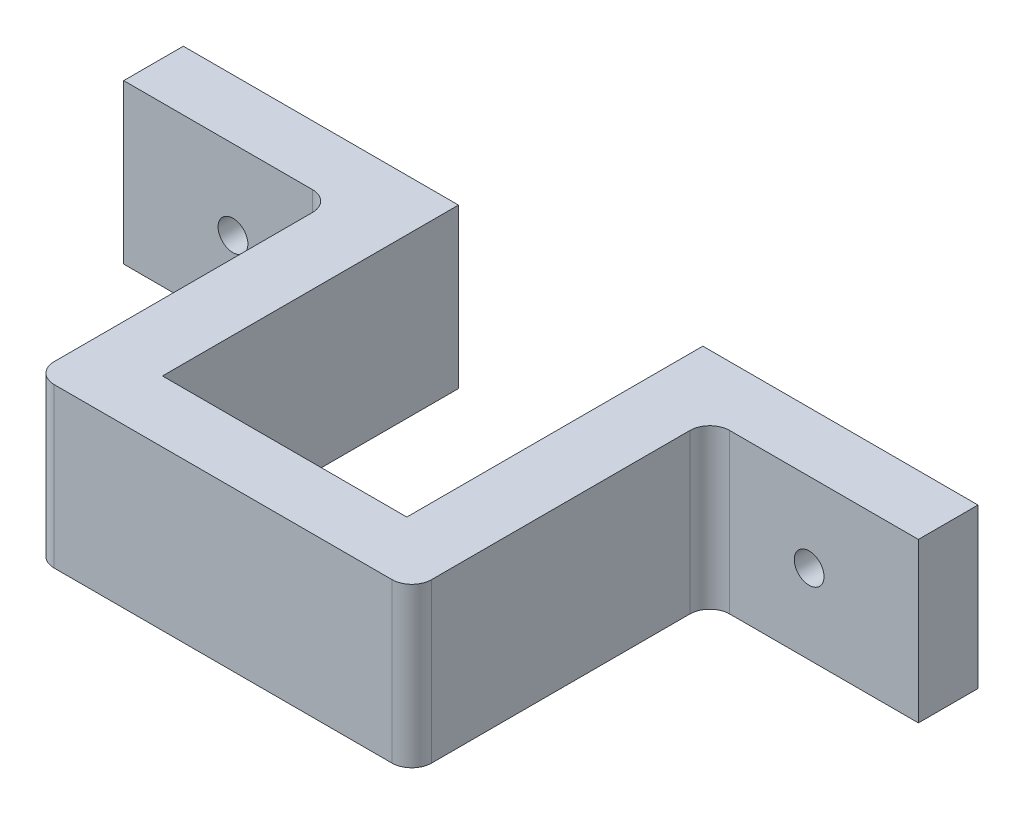
ISO-10303-21;
HEADER;
FILE_DESCRIPTION(('STEP AP214'),'2;1');
FILE_NAME('part.step','',(''),(''),'','','');
FILE_SCHEMA(('AUTOMOTIVE_DESIGN { 1 0 10303 214 1 1 1 1 }'));
ENDSEC;
DATA;
#1=APPLICATION_CONTEXT('core data for automotive mechanical design processes');
#2=APPLICATION_PROTOCOL_DEFINITION('international standard','automotive_design',2000,#1);
#3=PRODUCT_CONTEXT('',#1,'mechanical');
#4=PRODUCT('Part','Part','',(#3));
#5=PRODUCT_RELATED_PRODUCT_CATEGORY('part','',(#4));
#6=PRODUCT_DEFINITION_FORMATION('','',#4);
#7=PRODUCT_DEFINITION_CONTEXT('part definition',#1,'design');
#8=PRODUCT_DEFINITION('design','',#6,#7);
#9=PRODUCT_DEFINITION_SHAPE('','',#8);
#10=(LENGTH_UNIT() NAMED_UNIT(*) SI_UNIT(.MILLI.,.METRE.));
#11=(NAMED_UNIT(*) PLANE_ANGLE_UNIT() SI_UNIT($,.RADIAN.));
#12=(NAMED_UNIT(*) SI_UNIT($,.STERADIAN.) SOLID_ANGLE_UNIT());
#13=UNCERTAINTY_MEASURE_WITH_UNIT(LENGTH_MEASURE(1.E-05),#10,'distance_accuracy_value','');
#14=(GEOMETRIC_REPRESENTATION_CONTEXT(3) GLOBAL_UNCERTAINTY_ASSIGNED_CONTEXT((#13)) GLOBAL_UNIT_ASSIGNED_CONTEXT((#10,
#11,#12)) REPRESENTATION_CONTEXT('',''));
#15=CARTESIAN_POINT('',(0.,0.,0.));
#16=DIRECTION('',(0.,0.,1.));
#17=DIRECTION('',(1.,0.,0.));
#18=AXIS2_PLACEMENT_3D('',#15,#16,#17);
#19=CARTESIAN_POINT('',(0.,0.,0.));
#20=DIRECTION('',(0.,0.,1.));
#21=DIRECTION('',(1.,0.,0.));
#22=AXIS2_PLACEMENT_3D('',#19,#20,#21);
#23=PLANE('',#22);
#24=CARTESIAN_POINT('',(-14.5,0.,0.));
#25=DIRECTION('',(0.,0.,1.));
#26=DIRECTION('',(1.,0.,0.));
#27=AXIS2_PLACEMENT_3D('',#24,#25,#26);
#28=CIRCLE('',#27,0.75);
#29=CARTESIAN_POINT('',(-13.75,0.,0.));
#30=VERTEX_POINT('',#29);
#31=EDGE_CURVE('E196',#30,#30,#28,.T.);
#32=ORIENTED_EDGE('',*,*,#31,.T.);
#33=EDGE_LOOP('',(#32));
#34=FACE_BOUND('',#33,.T.);
#35=DIRECTION('',(-1.,0.,0.));
#36=VECTOR('',#35,1.);
#37=CARTESIAN_POINT('',(0.,4.,0.));
#38=LINE('',#37,#36);
#39=CARTESIAN_POINT('',(-6.15,4.,0.));
#40=VERTEX_POINT('',#39);
#41=CARTESIAN_POINT('',(-20.,4.,0.));
#42=VERTEX_POINT('',#41);
#43=EDGE_CURVE('E232',#40,#42,#38,.T.);
#44=ORIENTED_EDGE('',*,*,#43,.F.);
#45=DIRECTION('',(0.,-1.,0.));
#46=VECTOR('',#45,1.);
#47=CARTESIAN_POINT('',(-6.15,0.,0.));
#48=LINE('',#47,#46);
#49=CARTESIAN_POINT('',(-6.15,-4.,0.));
#50=VERTEX_POINT('',#49);
#51=EDGE_CURVE('E246',#40,#50,#48,.T.);
#52=ORIENTED_EDGE('',*,*,#51,.T.);
#53=DIRECTION('',(-1.,0.,0.));
#54=VECTOR('',#53,1.);
#55=CARTESIAN_POINT('',(0.,-4.,0.));
#56=LINE('',#55,#54);
#57=CARTESIAN_POINT('',(-20.,-4.,0.));
#58=VERTEX_POINT('',#57);
#59=EDGE_CURVE('E226',#50,#58,#56,.T.);
#60=ORIENTED_EDGE('',*,*,#59,.T.);
#61=DIRECTION('',(0.,1.,0.));
#62=VECTOR('',#61,1.);
#63=CARTESIAN_POINT('',(-20.,0.,0.));
#64=LINE('',#63,#62);
#65=EDGE_CURVE('E223',#58,#42,#64,.T.);
#66=ORIENTED_EDGE('',*,*,#65,.T.);
#67=EDGE_LOOP('',(#44,#52,#60,#66));
#68=FACE_BOUND('',#67,.T.);
#69=ADVANCED_FACE('F35',(#34,#68),#23,.F.);
#70=CARTESIAN_POINT('',(0.,0.,3.));
#71=DIRECTION('',(0.,0.,1.));
#72=DIRECTION('',(1.,0.,0.));
#73=AXIS2_PLACEMENT_3D('',#70,#71,#72);
#74=PLANE('',#73);
#75=DIRECTION('',(-1.,0.,0.));
#76=VECTOR('',#75,1.);
#77=CARTESIAN_POINT('',(0.,-4.,3.));
#78=LINE('',#77,#76);
#79=CARTESIAN_POINT('',(-10.5,-4.,3.));
#80=VERTEX_POINT('',#79);
#81=CARTESIAN_POINT('',(-20.,-4.,3.));
#82=VERTEX_POINT('',#81);
#83=EDGE_CURVE('E207',#80,#82,#78,.T.);
#84=ORIENTED_EDGE('',*,*,#83,.F.);
#85=DIRECTION('',(0.,-1.,0.));
#86=VECTOR('',#85,1.);
#87=CARTESIAN_POINT('',(-10.5,0.,3.));
#88=LINE('',#87,#86);
#89=CARTESIAN_POINT('',(-10.5,4.,3.));
#90=VERTEX_POINT('',#89);
#91=EDGE_CURVE('E274',#80,#90,#88,.F.);
#92=ORIENTED_EDGE('',*,*,#91,.T.);
#93=DIRECTION('',(-1.,0.,0.));
#94=VECTOR('',#93,1.);
#95=CARTESIAN_POINT('',(0.,4.,3.));
#96=LINE('',#95,#94);
#97=CARTESIAN_POINT('',(-20.,4.,3.));
#98=VERTEX_POINT('',#97);
#99=EDGE_CURVE('E214',#90,#98,#96,.T.);
#100=ORIENTED_EDGE('',*,*,#99,.T.);
#101=DIRECTION('',(0.,1.,0.));
#102=VECTOR('',#101,1.);
#103=CARTESIAN_POINT('',(-20.,0.,3.));
#104=LINE('',#103,#102);
#105=EDGE_CURVE('E204',#82,#98,#104,.T.);
#106=ORIENTED_EDGE('',*,*,#105,.F.);
#107=EDGE_LOOP('',(#84,#92,#100,#106));
#108=FACE_BOUND('',#107,.T.);
#109=CARTESIAN_POINT('',(-14.5,0.,3.));
#110=DIRECTION('',(0.,0.,1.));
#111=DIRECTION('',(1.,0.,0.));
#112=AXIS2_PLACEMENT_3D('',#109,#110,#111);
#113=CIRCLE('',#112,0.75);
#114=CARTESIAN_POINT('',(-13.75,0.,3.));
#115=VERTEX_POINT('',#114);
#116=EDGE_CURVE('E197',#115,#115,#113,.T.);
#117=ORIENTED_EDGE('',*,*,#116,.F.);
#118=EDGE_LOOP('',(#117));
#119=FACE_BOUND('',#118,.T.);
#120=ADVANCED_FACE('F286',(#108,#119),#74,.T.);
#121=CARTESIAN_POINT('',(-20.,0.,3.));
#122=DIRECTION('',(-1.,0.,0.));
#123=DIRECTION('',(0.,0.,1.));
#124=AXIS2_PLACEMENT_3D('',#121,#122,#123);
#125=PLANE('',#124);
#126=ORIENTED_EDGE('',*,*,#65,.F.);
#127=DIRECTION('',(0.,0.,-1.));
#128=VECTOR('',#127,1.);
#129=CARTESIAN_POINT('',(-20.,-4.,3.));
#130=LINE('',#129,#128);
#131=EDGE_CURVE('E242',#82,#58,#130,.T.);
#132=ORIENTED_EDGE('',*,*,#131,.F.);
#133=ORIENTED_EDGE('',*,*,#105,.T.);
#134=DIRECTION('',(0.,0.,-1.));
#135=VECTOR('',#134,1.);
#136=CARTESIAN_POINT('',(-20.,4.,3.));
#137=LINE('',#136,#135);
#138=EDGE_CURVE('E217',#98,#42,#137,.T.);
#139=ORIENTED_EDGE('',*,*,#138,.T.);
#140=EDGE_LOOP('',(#126,#132,#133,#139));
#141=FACE_BOUND('',#140,.T.);
#142=ADVANCED_FACE('F340',(#141),#125,.T.);
#143=CARTESIAN_POINT('',(0.,-4.,3.));
#144=DIRECTION('',(0.,-1.,0.));
#145=DIRECTION('',(1.,0.,0.));
#146=AXIS2_PLACEMENT_3D('',#143,#144,#145);
#147=PLANE('',#146);
#148=DIRECTION('',(1.,0.,0.));
#149=VECTOR('',#148,1.);
#150=CARTESIAN_POINT('',(9.5,-4.,18.));
#151=LINE('',#150,#149);
#152=CARTESIAN_POINT('',(-8.5,-4.,18.));
#153=VERTEX_POINT('',#152);
#154=CARTESIAN_POINT('',(8.5,-4.,18.));
#155=VERTEX_POINT('',#154);
#156=EDGE_CURVE('E178',#153,#155,#151,.T.);
#157=ORIENTED_EDGE('',*,*,#156,.F.);
#158=CARTESIAN_POINT('',(-8.5,-4.,17.));
#159=DIRECTION('',(0.,-1.,0.));
#160=DIRECTION('',(1.,0.,0.));
#161=AXIS2_PLACEMENT_3D('',#158,#159,#160);
#162=CIRCLE('',#161,1.);
#163=CARTESIAN_POINT('',(-9.5,-4.,17.));
#164=VERTEX_POINT('',#163);
#165=EDGE_CURVE('E257',#153,#164,#162,.T.);
#166=ORIENTED_EDGE('',*,*,#165,.T.);
#167=DIRECTION('',(0.,0.,-1.));
#168=VECTOR('',#167,1.);
#169=CARTESIAN_POINT('',(-9.5,-4.,18.));
#170=LINE('',#169,#168);
#171=CARTESIAN_POINT('',(-9.5,-4.,4.));
#172=VERTEX_POINT('',#171);
#173=EDGE_CURVE('E193',#164,#172,#170,.T.);
#174=ORIENTED_EDGE('',*,*,#173,.T.);
#175=CARTESIAN_POINT('',(-10.5,-4.,4.));
#176=DIRECTION('',(0.,-1.,0.));
#177=DIRECTION('',(1.,0.,0.));
#178=AXIS2_PLACEMENT_3D('',#175,#176,#177);
#179=CIRCLE('',#178,1.);
#180=EDGE_CURVE('E43',#172,#80,#179,.F.);
#181=ORIENTED_EDGE('',*,*,#180,.T.);
#182=ORIENTED_EDGE('',*,*,#83,.T.);
#183=ORIENTED_EDGE('',*,*,#131,.T.);
#184=ORIENTED_EDGE('',*,*,#59,.F.);
#185=DIRECTION('',(0.,0.,-1.));
#186=VECTOR('',#185,1.);
#187=CARTESIAN_POINT('',(-6.15,-4.,-14.9));
#188=LINE('',#187,#186);
#189=CARTESIAN_POINT('',(-6.15,-4.,14.9));
#190=VERTEX_POINT('',#189);
#191=EDGE_CURVE('E159',#190,#50,#188,.T.);
#192=ORIENTED_EDGE('',*,*,#191,.F.);
#193=DIRECTION('',(-1.,0.,0.));
#194=VECTOR('',#193,1.);
#195=CARTESIAN_POINT('',(6.15,-4.,14.9));
#196=LINE('',#195,#194);
#197=CARTESIAN_POINT('',(6.15,-4.,14.9));
#198=VERTEX_POINT('',#197);
#199=EDGE_CURVE('E158',#198,#190,#196,.T.);
#200=ORIENTED_EDGE('',*,*,#199,.F.);
#201=DIRECTION('',(0.,0.,1.));
#202=VECTOR('',#201,1.);
#203=CARTESIAN_POINT('',(6.15,-4.,-14.9));
#204=LINE('',#203,#202);
#205=CARTESIAN_POINT('',(6.15,-4.,0.));
#206=VERTEX_POINT('',#205);
#207=EDGE_CURVE('E147',#206,#198,#204,.T.);
#208=ORIENTED_EDGE('',*,*,#207,.F.);
#209=CARTESIAN_POINT('',(20.,-4.,0.));
#210=VERTEX_POINT('',#209);
#211=EDGE_CURVE('E227',#210,#206,#56,.T.);
#212=ORIENTED_EDGE('',*,*,#211,.F.);
#213=DIRECTION('',(0.,0.,-1.));
#214=VECTOR('',#213,1.);
#215=CARTESIAN_POINT('',(20.,-4.,3.));
#216=LINE('',#215,#214);
#217=CARTESIAN_POINT('',(20.,-4.,3.));
#218=VERTEX_POINT('',#217);
#219=EDGE_CURVE('E240',#218,#210,#216,.T.);
#220=ORIENTED_EDGE('',*,*,#219,.F.);
#221=CARTESIAN_POINT('',(10.5,-4.,3.));
#222=VERTEX_POINT('',#221);
#223=EDGE_CURVE('E208',#218,#222,#78,.T.);
#224=ORIENTED_EDGE('',*,*,#223,.T.);
#225=CARTESIAN_POINT('',(10.5,-4.,4.));
#226=DIRECTION('',(0.,-1.,0.));
#227=DIRECTION('',(1.,0.,0.));
#228=AXIS2_PLACEMENT_3D('',#225,#226,#227);
#229=CIRCLE('',#228,1.);
#230=CARTESIAN_POINT('',(9.5,-4.,4.));
#231=VERTEX_POINT('',#230);
#232=EDGE_CURVE('E277',#222,#231,#229,.F.);
#233=ORIENTED_EDGE('',*,*,#232,.T.);
#234=DIRECTION('',(0.,0.,-1.));
#235=VECTOR('',#234,1.);
#236=CARTESIAN_POINT('',(9.5,-4.,18.));
#237=LINE('',#236,#235);
#238=CARTESIAN_POINT('',(9.5,-4.,17.));
#239=VERTEX_POINT('',#238);
#240=EDGE_CURVE('E190',#239,#231,#237,.T.);
#241=ORIENTED_EDGE('',*,*,#240,.F.);
#242=CARTESIAN_POINT('',(8.5,-4.,17.));
#243=DIRECTION('',(0.,-1.,0.));
#244=DIRECTION('',(1.,0.,0.));
#245=AXIS2_PLACEMENT_3D('',#242,#243,#244);
#246=CIRCLE('',#245,1.);
#247=EDGE_CURVE('E255',#239,#155,#246,.T.);
#248=ORIENTED_EDGE('',*,*,#247,.T.);
#249=EDGE_LOOP('',(#157,#166,#174,#181,#182,#183,#184,#192,#200,#208,#212,#220,#224,#233,#241,#248));
#250=FACE_BOUND('',#249,.T.);
#251=ADVANCED_FACE('F171',(#250),#147,.T.);
#252=CARTESIAN_POINT('',(20.,0.,3.));
#253=DIRECTION('',(-1.,0.,0.));
#254=DIRECTION('',(0.,0.,1.));
#255=AXIS2_PLACEMENT_3D('',#252,#253,#254);
#256=PLANE('',#255);
#257=DIRECTION('',(0.,1.,0.));
#258=VECTOR('',#257,1.);
#259=CARTESIAN_POINT('',(20.,0.,0.));
#260=LINE('',#259,#258);
#261=CARTESIAN_POINT('',(20.,4.,0.));
#262=VERTEX_POINT('',#261);
#263=EDGE_CURVE('E229',#210,#262,#260,.T.);
#264=ORIENTED_EDGE('',*,*,#263,.T.);
#265=DIRECTION('',(0.,0.,-1.));
#266=VECTOR('',#265,1.);
#267=CARTESIAN_POINT('',(20.,4.,3.));
#268=LINE('',#267,#266);
#269=CARTESIAN_POINT('',(20.,4.,3.));
#270=VERTEX_POINT('',#269);
#271=EDGE_CURVE('E237',#270,#262,#268,.T.);
#272=ORIENTED_EDGE('',*,*,#271,.F.);
#273=DIRECTION('',(0.,1.,0.));
#274=VECTOR('',#273,1.);
#275=CARTESIAN_POINT('',(20.,0.,3.));
#276=LINE('',#275,#274);
#277=EDGE_CURVE('E211',#218,#270,#276,.T.);
#278=ORIENTED_EDGE('',*,*,#277,.F.);
#279=ORIENTED_EDGE('',*,*,#219,.T.);
#280=EDGE_LOOP('',(#264,#272,#278,#279));
#281=FACE_BOUND('',#280,.T.);
#282=ADVANCED_FACE('F322',(#281),#256,.F.);
#283=CARTESIAN_POINT('',(14.5,0.,3.));
#284=DIRECTION('',(0.,0.,-1.));
#285=DIRECTION('',(-1.,0.,0.));
#286=AXIS2_PLACEMENT_3D('',#283,#284,#285);
#287=CYLINDRICAL_SURFACE('',#286,0.75);
#288=CARTESIAN_POINT('',(14.5,0.,3.));
#289=DIRECTION('',(0.,0.,1.));
#290=DIRECTION('',(1.,0.,0.));
#291=AXIS2_PLACEMENT_3D('',#288,#289,#290);
#292=CIRCLE('',#291,0.75);
#293=CARTESIAN_POINT('',(15.25,0.,3.));
#294=VERTEX_POINT('',#293);
#295=EDGE_CURVE('E200',#294,#294,#292,.T.);
#296=ORIENTED_EDGE('',*,*,#295,.T.);
#297=EDGE_LOOP('',(#296));
#298=FACE_BOUND('',#297,.T.);
#299=CARTESIAN_POINT('',(14.5,0.,0.));
#300=DIRECTION('',(0.,0.,1.));
#301=DIRECTION('',(1.,0.,0.));
#302=AXIS2_PLACEMENT_3D('',#299,#300,#301);
#303=CIRCLE('',#302,0.75);
#304=CARTESIAN_POINT('',(15.25,0.,0.));
#305=VERTEX_POINT('',#304);
#306=EDGE_CURVE('E220',#305,#305,#303,.T.);
#307=ORIENTED_EDGE('',*,*,#306,.F.);
#308=EDGE_LOOP('',(#307));
#309=FACE_BOUND('',#308,.T.);
#310=ADVANCED_FACE('F355',(#298,#309),#287,.F.);
#311=CARTESIAN_POINT('',(-14.5,0.,3.));
#312=DIRECTION('',(0.,0.,-1.));
#313=DIRECTION('',(-1.,0.,0.));
#314=AXIS2_PLACEMENT_3D('',#311,#312,#313);
#315=CYLINDRICAL_SURFACE('',#314,0.75);
#316=ORIENTED_EDGE('',*,*,#116,.T.);
#317=EDGE_LOOP('',(#316));
#318=FACE_BOUND('',#317,.T.);
#319=ORIENTED_EDGE('',*,*,#31,.F.);
#320=EDGE_LOOP('',(#319));
#321=FACE_BOUND('',#320,.T.);
#322=ADVANCED_FACE('F358',(#318,#321),#315,.F.);
#323=CARTESIAN_POINT('',(0.,4.,3.));
#324=DIRECTION('',(0.,-1.,0.));
#325=DIRECTION('',(1.,0.,0.));
#326=AXIS2_PLACEMENT_3D('',#323,#324,#325);
#327=PLANE('',#326);
#328=DIRECTION('',(0.,0.,-1.));
#329=VECTOR('',#328,1.);
#330=CARTESIAN_POINT('',(-9.5,4.,18.));
#331=LINE('',#330,#329);
#332=CARTESIAN_POINT('',(-9.5,4.,17.));
#333=VERTEX_POINT('',#332);
#334=CARTESIAN_POINT('',(-9.5,4.,4.));
#335=VERTEX_POINT('',#334);
#336=EDGE_CURVE('E185',#333,#335,#331,.T.);
#337=ORIENTED_EDGE('',*,*,#336,.F.);
#338=CARTESIAN_POINT('',(-8.5,4.,17.));
#339=DIRECTION('',(0.,-1.,0.));
#340=DIRECTION('',(1.,0.,0.));
#341=AXIS2_PLACEMENT_3D('',#338,#339,#340);
#342=CIRCLE('',#341,1.);
#343=CARTESIAN_POINT('',(-8.5,4.,18.));
#344=VERTEX_POINT('',#343);
#345=EDGE_CURVE('E266',#333,#344,#342,.F.);
#346=ORIENTED_EDGE('',*,*,#345,.T.);
#347=DIRECTION('',(-1.,0.,0.));
#348=VECTOR('',#347,1.);
#349=CARTESIAN_POINT('',(9.5,4.,18.));
#350=LINE('',#349,#348);
#351=CARTESIAN_POINT('',(8.5,4.,18.));
#352=VERTEX_POINT('',#351);
#353=EDGE_CURVE('E181',#352,#344,#350,.T.);
#354=ORIENTED_EDGE('',*,*,#353,.F.);
#355=CARTESIAN_POINT('',(8.5,4.,17.));
#356=DIRECTION('',(0.,-1.,0.));
#357=DIRECTION('',(1.,0.,0.));
#358=AXIS2_PLACEMENT_3D('',#355,#356,#357);
#359=CIRCLE('',#358,1.);
#360=CARTESIAN_POINT('',(9.5,4.,17.));
#361=VERTEX_POINT('',#360);
#362=EDGE_CURVE('E264',#352,#361,#359,.F.);
#363=ORIENTED_EDGE('',*,*,#362,.T.);
#364=DIRECTION('',(0.,0.,-1.));
#365=VECTOR('',#364,1.);
#366=CARTESIAN_POINT('',(9.5,4.,18.));
#367=LINE('',#366,#365);
#368=CARTESIAN_POINT('',(9.5,4.,4.));
#369=VERTEX_POINT('',#368);
#370=EDGE_CURVE('E188',#361,#369,#367,.T.);
#371=ORIENTED_EDGE('',*,*,#370,.T.);
#372=CARTESIAN_POINT('',(10.5,4.,4.));
#373=DIRECTION('',(0.,-1.,0.));
#374=DIRECTION('',(1.,0.,0.));
#375=AXIS2_PLACEMENT_3D('',#372,#373,#374);
#376=CIRCLE('',#375,1.);
#377=CARTESIAN_POINT('',(10.5,4.,3.));
#378=VERTEX_POINT('',#377);
#379=EDGE_CURVE('E50',#369,#378,#376,.T.);
#380=ORIENTED_EDGE('',*,*,#379,.T.);
#381=EDGE_CURVE('E215',#270,#378,#96,.T.);
#382=ORIENTED_EDGE('',*,*,#381,.F.);
#383=ORIENTED_EDGE('',*,*,#271,.T.);
#384=CARTESIAN_POINT('',(6.15,4.,0.));
#385=VERTEX_POINT('',#384);
#386=EDGE_CURVE('E201',#262,#385,#38,.T.);
#387=ORIENTED_EDGE('',*,*,#386,.T.);
#388=DIRECTION('',(0.,0.,-1.));
#389=VECTOR('',#388,1.);
#390=CARTESIAN_POINT('',(6.15,4.,-14.9));
#391=LINE('',#390,#389);
#392=CARTESIAN_POINT('',(6.15,4.,14.9));
#393=VERTEX_POINT('',#392);
#394=EDGE_CURVE('E176',#393,#385,#391,.T.);
#395=ORIENTED_EDGE('',*,*,#394,.F.);
#396=DIRECTION('',(1.,0.,0.));
#397=VECTOR('',#396,1.);
#398=CARTESIAN_POINT('',(6.15,4.,14.9));
#399=LINE('',#398,#397);
#400=CARTESIAN_POINT('',(-6.15,4.,14.9));
#401=VERTEX_POINT('',#400);
#402=EDGE_CURVE('E167',#401,#393,#399,.T.);
#403=ORIENTED_EDGE('',*,*,#402,.F.);
#404=DIRECTION('',(0.,0.,1.));
#405=VECTOR('',#404,1.);
#406=CARTESIAN_POINT('',(-6.15,4.,-14.9));
#407=LINE('',#406,#405);
#408=EDGE_CURVE('E182',#40,#401,#407,.T.);
#409=ORIENTED_EDGE('',*,*,#408,.F.);
#410=ORIENTED_EDGE('',*,*,#43,.T.);
#411=ORIENTED_EDGE('',*,*,#138,.F.);
#412=ORIENTED_EDGE('',*,*,#99,.F.);
#413=CARTESIAN_POINT('',(-10.5,4.,4.));
#414=DIRECTION('',(0.,-1.,0.));
#415=DIRECTION('',(1.,0.,0.));
#416=AXIS2_PLACEMENT_3D('',#413,#414,#415);
#417=CIRCLE('',#416,1.);
#418=EDGE_CURVE('E11',#90,#335,#417,.T.);
#419=ORIENTED_EDGE('',*,*,#418,.T.);
#420=EDGE_LOOP('',(#337,#346,#354,#363,#371,#380,#382,#383,#387,#395,#403,#409,#410,#411,#412,#419));
#421=FACE_BOUND('',#420,.T.);
#422=ADVANCED_FACE('F291',(#421),#327,.F.);
#423=ORIENTED_EDGE('',*,*,#381,.T.);
#424=DIRECTION('',(0.,1.,0.));
#425=VECTOR('',#424,1.);
#426=CARTESIAN_POINT('',(10.5,0.,3.));
#427=LINE('',#426,#425);
#428=EDGE_CURVE('E272',#378,#222,#427,.F.);
#429=ORIENTED_EDGE('',*,*,#428,.T.);
#430=ORIENTED_EDGE('',*,*,#223,.F.);
#431=ORIENTED_EDGE('',*,*,#277,.T.);
#432=EDGE_LOOP('',(#423,#429,#430,#431));
#433=FACE_BOUND('',#432,.T.);
#434=ORIENTED_EDGE('',*,*,#295,.F.);
#435=EDGE_LOOP('',(#434));
#436=FACE_BOUND('',#435,.T.);
#437=ADVANCED_FACE('F317',(#433,#436),#74,.T.);
#438=ORIENTED_EDGE('',*,*,#306,.T.);
#439=EDGE_LOOP('',(#438));
#440=FACE_BOUND('',#439,.T.);
#441=ORIENTED_EDGE('',*,*,#211,.T.);
#442=DIRECTION('',(0.,1.,0.));
#443=VECTOR('',#442,1.);
#444=CARTESIAN_POINT('',(6.15,0.,0.));
#445=LINE('',#444,#443);
#446=EDGE_CURVE('E153',#206,#385,#445,.T.);
#447=ORIENTED_EDGE('',*,*,#446,.T.);
#448=ORIENTED_EDGE('',*,*,#386,.F.);
#449=ORIENTED_EDGE('',*,*,#263,.F.);
#450=EDGE_LOOP('',(#441,#447,#448,#449));
#451=FACE_BOUND('',#450,.T.);
#452=ADVANCED_FACE('F324',(#440,#451),#23,.F.);
#453=CARTESIAN_POINT('',(-9.5,-4.,18.));
#454=DIRECTION('',(1.,0.,0.));
#455=DIRECTION('',(0.,0.,-1.));
#456=AXIS2_PLACEMENT_3D('',#453,#454,#455);
#457=PLANE('',#456);
#458=ORIENTED_EDGE('',*,*,#173,.F.);
#459=DIRECTION('',(0.,-1.,0.));
#460=VECTOR('',#459,1.);
#461=CARTESIAN_POINT('',(-9.5,4.,17.));
#462=LINE('',#461,#460);
#463=EDGE_CURVE('E262',#164,#333,#462,.F.);
#464=ORIENTED_EDGE('',*,*,#463,.T.);
#465=ORIENTED_EDGE('',*,*,#336,.T.);
#466=DIRECTION('',(0.,-1.,0.));
#467=VECTOR('',#466,1.);
#468=CARTESIAN_POINT('',(-9.5,-4.,4.));
#469=LINE('',#468,#467);
#470=EDGE_CURVE('E259',#335,#172,#469,.T.);
#471=ORIENTED_EDGE('',*,*,#470,.T.);
#472=EDGE_LOOP('',(#458,#464,#465,#471));
#473=FACE_BOUND('',#472,.T.);
#474=ADVANCED_FACE('F295',(#473),#457,.F.);
#475=CARTESIAN_POINT('',(9.5,-4.,18.));
#476=DIRECTION('',(-1.,0.,0.));
#477=DIRECTION('',(0.,0.,1.));
#478=AXIS2_PLACEMENT_3D('',#475,#476,#477);
#479=PLANE('',#478);
#480=ORIENTED_EDGE('',*,*,#370,.F.);
#481=DIRECTION('',(0.,1.,0.));
#482=VECTOR('',#481,1.);
#483=CARTESIAN_POINT('',(9.5,-4.,17.));
#484=LINE('',#483,#482);
#485=EDGE_CURVE('E270',#361,#239,#484,.F.);
#486=ORIENTED_EDGE('',*,*,#485,.T.);
#487=ORIENTED_EDGE('',*,*,#240,.T.);
#488=DIRECTION('',(0.,1.,0.));
#489=VECTOR('',#488,1.);
#490=CARTESIAN_POINT('',(9.5,-4.,4.));
#491=LINE('',#490,#489);
#492=EDGE_CURVE('E268',#231,#369,#491,.T.);
#493=ORIENTED_EDGE('',*,*,#492,.T.);
#494=EDGE_LOOP('',(#480,#486,#487,#493));
#495=FACE_BOUND('',#494,.T.);
#496=ADVANCED_FACE('F310',(#495),#479,.F.);
#497=CARTESIAN_POINT('',(0.,0.,18.));
#498=DIRECTION('',(0.,0.,1.));
#499=DIRECTION('',(1.,0.,0.));
#500=AXIS2_PLACEMENT_3D('',#497,#498,#499);
#501=PLANE('',#500);
#502=ORIENTED_EDGE('',*,*,#353,.T.);
#503=DIRECTION('',(0.,-1.,0.));
#504=VECTOR('',#503,1.);
#505=CARTESIAN_POINT('',(-8.5,-4.,18.));
#506=LINE('',#505,#504);
#507=EDGE_CURVE('E252',#344,#153,#506,.T.);
#508=ORIENTED_EDGE('',*,*,#507,.T.);
#509=ORIENTED_EDGE('',*,*,#156,.T.);
#510=DIRECTION('',(0.,1.,0.));
#511=VECTOR('',#510,1.);
#512=CARTESIAN_POINT('',(8.5,4.,18.));
#513=LINE('',#512,#511);
#514=EDGE_CURVE('E249',#155,#352,#513,.T.);
#515=ORIENTED_EDGE('',*,*,#514,.T.);
#516=EDGE_LOOP('',(#502,#508,#509,#515));
#517=FACE_BOUND('',#516,.T.);
#518=ADVANCED_FACE('F302',(#517),#501,.T.);
#519=CARTESIAN_POINT('',(-6.15000000000001,36.2386414105806,-14.9));
#520=DIRECTION('',(-1.,0.,0.));
#521=DIRECTION('',(0.,-1.,0.));
#522=AXIS2_PLACEMENT_3D('',#519,#520,#521);
#523=PLANE('',#522);
#524=ORIENTED_EDGE('',*,*,#408,.T.);
#525=DIRECTION('',(0.,-1.,0.));
#526=VECTOR('',#525,1.);
#527=CARTESIAN_POINT('',(-6.15000000000001,36.2386414105806,14.9));
#528=LINE('',#527,#526);
#529=EDGE_CURVE('E168',#401,#190,#528,.T.);
#530=ORIENTED_EDGE('',*,*,#529,.T.);
#531=ORIENTED_EDGE('',*,*,#191,.T.);
#532=ORIENTED_EDGE('',*,*,#51,.F.);
#533=EDGE_LOOP('',(#524,#530,#531,#532));
#534=FACE_BOUND('',#533,.T.);
#535=ADVANCED_FACE('F399',(#534),#523,.F.);
#536=CARTESIAN_POINT('',(6.15,36.2386414105806,-14.9));
#537=DIRECTION('',(1.,0.,0.));
#538=DIRECTION('',(0.,1.,0.));
#539=AXIS2_PLACEMENT_3D('',#536,#537,#538);
#540=PLANE('',#539);
#541=ORIENTED_EDGE('',*,*,#207,.T.);
#542=DIRECTION('',(0.,-1.,0.));
#543=VECTOR('',#542,1.);
#544=CARTESIAN_POINT('',(6.15,36.2386414105806,14.9));
#545=LINE('',#544,#543);
#546=EDGE_CURVE('E150',#393,#198,#545,.T.);
#547=ORIENTED_EDGE('',*,*,#546,.F.);
#548=ORIENTED_EDGE('',*,*,#394,.T.);
#549=ORIENTED_EDGE('',*,*,#446,.F.);
#550=EDGE_LOOP('',(#541,#547,#548,#549));
#551=FACE_BOUND('',#550,.T.);
#552=ADVANCED_FACE('F149',(#551),#540,.F.);
#553=CARTESIAN_POINT('',(6.15,36.2386414105806,14.9));
#554=DIRECTION('',(0.,0.,1.));
#555=DIRECTION('',(1.,0.,0.));
#556=AXIS2_PLACEMENT_3D('',#553,#554,#555);
#557=PLANE('',#556);
#558=ORIENTED_EDGE('',*,*,#402,.T.);
#559=ORIENTED_EDGE('',*,*,#546,.T.);
#560=ORIENTED_EDGE('',*,*,#199,.T.);
#561=ORIENTED_EDGE('',*,*,#529,.F.);
#562=EDGE_LOOP('',(#558,#559,#560,#561));
#563=FACE_BOUND('',#562,.T.);
#564=ADVANCED_FACE('F163',(#563),#557,.F.);
#565=CARTESIAN_POINT('',(-8.5,0.,17.));
#566=DIRECTION('',(0.,1.,0.));
#567=DIRECTION('',(0.,0.,1.));
#568=AXIS2_PLACEMENT_3D('',#565,#566,#567);
#569=CYLINDRICAL_SURFACE('',#568,1.);
#570=ORIENTED_EDGE('',*,*,#345,.F.);
#571=ORIENTED_EDGE('',*,*,#463,.F.);
#572=ORIENTED_EDGE('',*,*,#165,.F.);
#573=ORIENTED_EDGE('',*,*,#507,.F.);
#574=EDGE_LOOP('',(#570,#571,#572,#573));
#575=FACE_BOUND('',#574,.T.);
#576=ADVANCED_FACE('F298',(#575),#569,.T.);
#577=CARTESIAN_POINT('',(8.5,0.,17.));
#578=DIRECTION('',(0.,-1.,0.));
#579=DIRECTION('',(0.,0.,-1.));
#580=AXIS2_PLACEMENT_3D('',#577,#578,#579);
#581=CYLINDRICAL_SURFACE('',#580,1.);
#582=ORIENTED_EDGE('',*,*,#247,.F.);
#583=ORIENTED_EDGE('',*,*,#485,.F.);
#584=ORIENTED_EDGE('',*,*,#362,.F.);
#585=ORIENTED_EDGE('',*,*,#514,.F.);
#586=EDGE_LOOP('',(#582,#583,#584,#585));
#587=FACE_BOUND('',#586,.T.);
#588=ADVANCED_FACE('F306',(#587),#581,.T.);
#589=CARTESIAN_POINT('',(10.5,-4.,4.));
#590=DIRECTION('',(0.,1.,0.));
#591=DIRECTION('',(0.,0.,1.));
#592=AXIS2_PLACEMENT_3D('',#589,#590,#591);
#593=CYLINDRICAL_SURFACE('',#592,1.);
#594=ORIENTED_EDGE('',*,*,#232,.F.);
#595=ORIENTED_EDGE('',*,*,#428,.F.);
#596=ORIENTED_EDGE('',*,*,#379,.F.);
#597=ORIENTED_EDGE('',*,*,#492,.F.);
#598=EDGE_LOOP('',(#594,#595,#596,#597));
#599=FACE_BOUND('',#598,.T.);
#600=ADVANCED_FACE('F313',(#599),#593,.F.);
#601=CARTESIAN_POINT('',(-10.5,-4.,4.));
#602=DIRECTION('',(0.,-1.,0.));
#603=DIRECTION('',(0.,0.,-1.));
#604=AXIS2_PLACEMENT_3D('',#601,#602,#603);
#605=CYLINDRICAL_SURFACE('',#604,1.);
#606=ORIENTED_EDGE('',*,*,#418,.F.);
#607=ORIENTED_EDGE('',*,*,#91,.F.);
#608=ORIENTED_EDGE('',*,*,#180,.F.);
#609=ORIENTED_EDGE('',*,*,#470,.F.);
#610=EDGE_LOOP('',(#606,#607,#608,#609));
#611=FACE_BOUND('',#610,.T.);
#612=ADVANCED_FACE('F37',(#611),#605,.F.);
#613=CLOSED_SHELL('',(#69,#120,#142,#251,#282,#310,#322,#422,#437,#452,#474,#496,#518,#535,#552,
#564,#576,#588,#600,#612));
#614=MANIFOLD_SOLID_BREP('B2',#613);
#615=ADVANCED_BREP_SHAPE_REPRESENTATION('',(#18,#614),#14);
#616=SHAPE_DEFINITION_REPRESENTATION(#9,#615);
ENDSEC;
END-ISO-10303-21;
